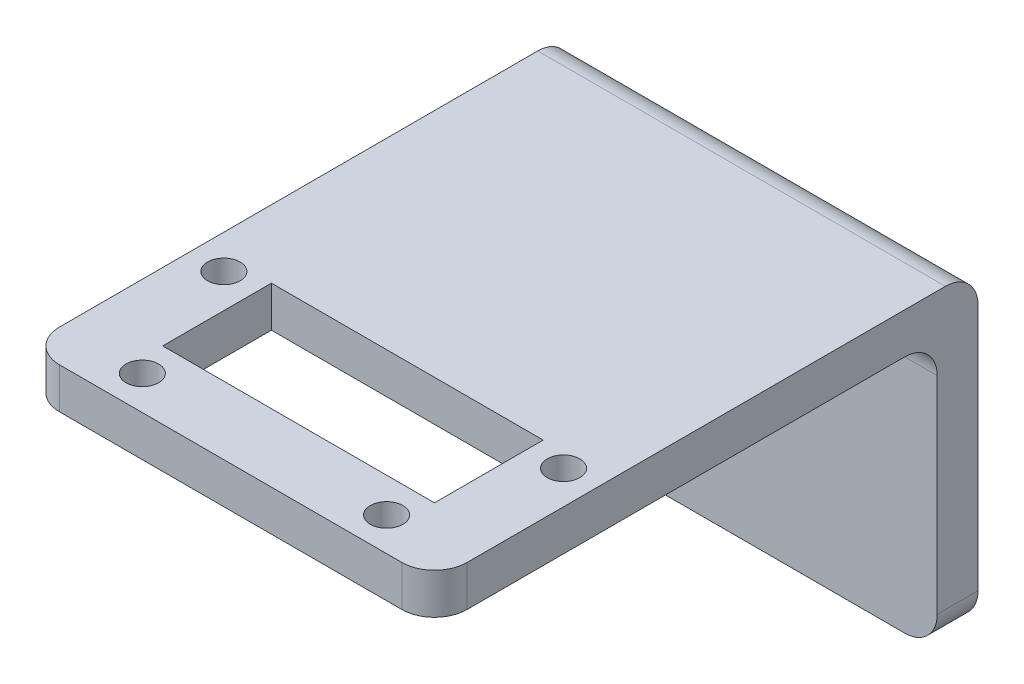
ISO-10303-21;
HEADER;
FILE_DESCRIPTION(('STEP AP214'),'2;1');
FILE_NAME('part.step','',(''),(''),'','','');
FILE_SCHEMA(('AUTOMOTIVE_DESIGN { 1 0 10303 214 1 1 1 1 }'));
ENDSEC;
DATA;
#1=APPLICATION_CONTEXT('core data for automotive mechanical design processes');
#2=APPLICATION_PROTOCOL_DEFINITION('international standard','automotive_design',2000,#1);
#3=PRODUCT_CONTEXT('',#1,'mechanical');
#4=PRODUCT('Part','Part','',(#3));
#5=PRODUCT_RELATED_PRODUCT_CATEGORY('part','',(#4));
#6=PRODUCT_DEFINITION_FORMATION('','',#4);
#7=PRODUCT_DEFINITION_CONTEXT('part definition',#1,'design');
#8=PRODUCT_DEFINITION('design','',#6,#7);
#9=PRODUCT_DEFINITION_SHAPE('','',#8);
#10=(LENGTH_UNIT() NAMED_UNIT(*) SI_UNIT(.MILLI.,.METRE.));
#11=(NAMED_UNIT(*) PLANE_ANGLE_UNIT() SI_UNIT($,.RADIAN.));
#12=(NAMED_UNIT(*) SI_UNIT($,.STERADIAN.) SOLID_ANGLE_UNIT());
#13=UNCERTAINTY_MEASURE_WITH_UNIT(LENGTH_MEASURE(1.E-05),#10,'distance_accuracy_value','');
#14=(GEOMETRIC_REPRESENTATION_CONTEXT(3) GLOBAL_UNCERTAINTY_ASSIGNED_CONTEXT((#13)) GLOBAL_UNIT_ASSIGNED_CONTEXT((#10,
#11,#12)) REPRESENTATION_CONTEXT('',''));
#15=CARTESIAN_POINT('',(0.,0.,0.));
#16=DIRECTION('',(0.,0.,1.));
#17=DIRECTION('',(1.,0.,0.));
#18=AXIS2_PLACEMENT_3D('',#15,#16,#17);
#19=CARTESIAN_POINT('',(0.,0.,0.));
#20=DIRECTION('',(0.,-1.,0.));
#21=DIRECTION('',(0.,0.,-1.));
#22=AXIS2_PLACEMENT_3D('',#19,#20,#21);
#23=PLANE('',#22);
#24=CARTESIAN_POINT('',(-12.5,0.,8.));
#25=DIRECTION('',(0.,-1.,0.));
#26=DIRECTION('',(0.,0.,-1.));
#27=AXIS2_PLACEMENT_3D('',#24,#25,#26);
#28=CIRCLE('',#27,1.2);
#29=CARTESIAN_POINT('',(-12.5,0.,6.8));
#30=VERTEX_POINT('',#29);
#31=EDGE_CURVE('E291',#30,#30,#28,.T.);
#32=ORIENTED_EDGE('',*,*,#31,.F.);
#33=EDGE_LOOP('',(#32));
#34=FACE_BOUND('',#33,.T.);
#35=CARTESIAN_POINT('',(9.00935720361294,0.,17.5339337442584));
#36=DIRECTION('',(0.,-1.,0.));
#37=DIRECTION('',(0.,0.,1.));
#38=AXIS2_PLACEMENT_3D('',#35,#36,#37);
#39=CIRCLE('',#38,1.2);
#40=CARTESIAN_POINT('',(9.00935720361294,0.,18.7339337442584));
#41=VERTEX_POINT('',#40);
#42=EDGE_CURVE('E304',#41,#41,#39,.T.);
#43=ORIENTED_EDGE('',*,*,#42,.F.);
#44=EDGE_LOOP('',(#43));
#45=FACE_BOUND('',#44,.T.);
#46=CARTESIAN_POINT('',(12.5451325660364,0.,8.04719075277392));
#47=DIRECTION('',(0.,-1.,0.));
#48=DIRECTION('',(0.,0.,1.));
#49=AXIS2_PLACEMENT_3D('',#46,#47,#48);
#50=CIRCLE('',#49,1.2);
#51=CARTESIAN_POINT('',(12.5451325660364,0.,9.24719075277392));
#52=VERTEX_POINT('',#51);
#53=EDGE_CURVE('E298',#52,#52,#50,.T.);
#54=ORIENTED_EDGE('',*,*,#53,.F.);
#55=EDGE_LOOP('',(#54));
#56=FACE_BOUND('',#55,.T.);
#57=CARTESIAN_POINT('',(-9.,0.,17.5));
#58=DIRECTION('',(0.,-1.,0.));
#59=DIRECTION('',(0.,0.,-1.));
#60=AXIS2_PLACEMENT_3D('',#57,#58,#59);
#61=CIRCLE('',#60,1.2);
#62=CARTESIAN_POINT('',(-9.,0.,16.3));
#63=VERTEX_POINT('',#62);
#64=EDGE_CURVE('E183',#63,#63,#61,.T.);
#65=ORIENTED_EDGE('',*,*,#64,.F.);
#66=EDGE_LOOP('',(#65));
#67=FACE_BOUND('',#66,.T.);
#68=DIRECTION('',(0.,0.,-1.));
#69=VECTOR('',#68,1.);
#70=CARTESIAN_POINT('',(10.,0.,7.00000000000001));
#71=LINE('',#70,#69);
#72=CARTESIAN_POINT('',(10.,0.,15.));
#73=VERTEX_POINT('',#72);
#74=CARTESIAN_POINT('',(10.,0.,7.00000000000001));
#75=VERTEX_POINT('',#74);
#76=EDGE_CURVE('E157',#73,#75,#71,.T.);
#77=ORIENTED_EDGE('',*,*,#76,.T.);
#78=DIRECTION('',(-1.,0.,0.));
#79=VECTOR('',#78,1.);
#80=CARTESIAN_POINT('',(-10.,0.,7.00000000000001));
#81=LINE('',#80,#79);
#82=CARTESIAN_POINT('',(-10.,0.,7.00000000000001));
#83=VERTEX_POINT('',#82);
#84=EDGE_CURVE('E169',#75,#83,#81,.T.);
#85=ORIENTED_EDGE('',*,*,#84,.T.);
#86=DIRECTION('',(0.,0.,1.));
#87=VECTOR('',#86,1.);
#88=CARTESIAN_POINT('',(-10.,0.,15.));
#89=LINE('',#88,#87);
#90=CARTESIAN_POINT('',(-10.,0.,15.));
#91=VERTEX_POINT('',#90);
#92=EDGE_CURVE('E173',#83,#91,#89,.T.);
#93=ORIENTED_EDGE('',*,*,#92,.T.);
#94=DIRECTION('',(1.,0.,0.));
#95=VECTOR('',#94,1.);
#96=CARTESIAN_POINT('',(10.,0.,15.));
#97=LINE('',#96,#95);
#98=EDGE_CURVE('E165',#91,#73,#97,.T.);
#99=ORIENTED_EDGE('',*,*,#98,.T.);
#100=EDGE_LOOP('',(#77,#85,#93,#99));
#101=FACE_BOUND('',#100,.T.);
#102=DIRECTION('',(0.,0.,-1.));
#103=VECTOR('',#102,1.);
#104=CARTESIAN_POINT('',(15.,0.,20.));
#105=LINE('',#104,#103);
#106=CARTESIAN_POINT('',(15.,0.,17.6));
#107=VERTEX_POINT('',#106);
#108=CARTESIAN_POINT('',(15.,0.,-14.6));
#109=VERTEX_POINT('',#108);
#110=EDGE_CURVE('E196',#107,#109,#105,.T.);
#111=ORIENTED_EDGE('',*,*,#110,.F.);
#112=CARTESIAN_POINT('',(12.6,0.,17.6));
#113=DIRECTION('',(0.,-1.,0.));
#114=DIRECTION('',(0.,0.,-1.));
#115=AXIS2_PLACEMENT_3D('',#112,#113,#114);
#116=CIRCLE('',#115,2.4);
#117=CARTESIAN_POINT('',(12.6,0.,20.));
#118=VERTEX_POINT('',#117);
#119=EDGE_CURVE('E245',#107,#118,#116,.T.);
#120=ORIENTED_EDGE('',*,*,#119,.T.);
#121=DIRECTION('',(1.,0.,0.));
#122=VECTOR('',#121,1.);
#123=CARTESIAN_POINT('',(-15.,0.,20.));
#124=LINE('',#123,#122);
#125=CARTESIAN_POINT('',(-12.6,0.,20.));
#126=VERTEX_POINT('',#125);
#127=EDGE_CURVE('E203',#126,#118,#124,.T.);
#128=ORIENTED_EDGE('',*,*,#127,.F.);
#129=CARTESIAN_POINT('',(-12.6,0.,17.6));
#130=DIRECTION('',(0.,-1.,0.));
#131=DIRECTION('',(0.,0.,-1.));
#132=AXIS2_PLACEMENT_3D('',#129,#130,#131);
#133=CIRCLE('',#132,2.4);
#134=CARTESIAN_POINT('',(-15.,0.,17.6));
#135=VERTEX_POINT('',#134);
#136=EDGE_CURVE('E243',#126,#135,#133,.T.);
#137=ORIENTED_EDGE('',*,*,#136,.T.);
#138=DIRECTION('',(0.,0.,1.));
#139=VECTOR('',#138,1.);
#140=CARTESIAN_POINT('',(-15.,0.,-20.));
#141=LINE('',#140,#139);
#142=CARTESIAN_POINT('',(-15.,0.,-14.6));
#143=VERTEX_POINT('',#142);
#144=EDGE_CURVE('E211',#143,#135,#141,.T.);
#145=ORIENTED_EDGE('',*,*,#144,.F.);
#146=DIRECTION('',(1.,0.,0.));
#147=VECTOR('',#146,1.);
#148=CARTESIAN_POINT('',(15.,0.,-14.6));
#149=LINE('',#148,#147);
#150=EDGE_CURVE('E219',#143,#109,#149,.T.);
#151=ORIENTED_EDGE('',*,*,#150,.T.);
#152=EDGE_LOOP('',(#111,#120,#128,#137,#145,#151));
#153=FACE_BOUND('',#152,.T.);
#154=ADVANCED_FACE('F38',(#34,#45,#56,#67,#101,#153),#23,.T.);
#155=CARTESIAN_POINT('',(15.,3.,20.));
#156=DIRECTION('',(-1.,0.,0.));
#157=DIRECTION('',(0.,0.,1.));
#158=AXIS2_PLACEMENT_3D('',#155,#156,#157);
#159=PLANE('',#158);
#160=DIRECTION('',(0.,1.,0.));
#161=VECTOR('',#160,1.);
#162=CARTESIAN_POINT('',(15.,-20.,-17.));
#163=LINE('',#162,#161);
#164=CARTESIAN_POINT('',(15.,-17.6,-17.));
#165=VERTEX_POINT('',#164);
#166=CARTESIAN_POINT('',(15.,-2.4,-17.));
#167=VERTEX_POINT('',#166);
#168=EDGE_CURVE('E280',#165,#167,#163,.T.);
#169=ORIENTED_EDGE('',*,*,#168,.F.);
#170=DIRECTION('',(0.,0.,1.));
#171=VECTOR('',#170,1.);
#172=CARTESIAN_POINT('',(15.,-17.6,-20.));
#173=LINE('',#172,#171);
#174=CARTESIAN_POINT('',(15.,-17.6,-20.));
#175=VERTEX_POINT('',#174);
#176=EDGE_CURVE('E61',#165,#175,#173,.F.);
#177=ORIENTED_EDGE('',*,*,#176,.T.);
#178=DIRECTION('',(0.,-1.,0.));
#179=VECTOR('',#178,1.);
#180=CARTESIAN_POINT('',(15.,3.,-20.));
#181=LINE('',#180,#179);
#182=CARTESIAN_POINT('',(15.,0.6,-20.));
#183=VERTEX_POINT('',#182);
#184=EDGE_CURVE('E217',#183,#175,#181,.T.);
#185=ORIENTED_EDGE('',*,*,#184,.F.);
#186=CARTESIAN_POINT('',(15.,0.6,-17.6));
#187=DIRECTION('',(-1.,0.,0.));
#188=DIRECTION('',(0.,0.,1.));
#189=AXIS2_PLACEMENT_3D('',#186,#187,#188);
#190=CIRCLE('',#189,2.4);
#191=CARTESIAN_POINT('',(15.,3.,-17.6));
#192=VERTEX_POINT('',#191);
#193=EDGE_CURVE('E237',#183,#192,#190,.F.);
#194=ORIENTED_EDGE('',*,*,#193,.T.);
#195=DIRECTION('',(0.,0.,-1.));
#196=VECTOR('',#195,1.);
#197=CARTESIAN_POINT('',(15.,3.,20.));
#198=LINE('',#197,#196);
#199=CARTESIAN_POINT('',(15.,3.,17.6));
#200=VERTEX_POINT('',#199);
#201=EDGE_CURVE('E200',#200,#192,#198,.T.);
#202=ORIENTED_EDGE('',*,*,#201,.F.);
#203=DIRECTION('',(0.,-1.,0.));
#204=VECTOR('',#203,1.);
#205=CARTESIAN_POINT('',(15.,3.,17.6));
#206=LINE('',#205,#204);
#207=EDGE_CURVE('E240',#200,#107,#206,.T.);
#208=ORIENTED_EDGE('',*,*,#207,.T.);
#209=ORIENTED_EDGE('',*,*,#110,.T.);
#210=CARTESIAN_POINT('',(15.,-2.4,-14.6));
#211=DIRECTION('',(-1.,0.,0.));
#212=DIRECTION('',(0.,0.,1.));
#213=AXIS2_PLACEMENT_3D('',#210,#211,#212);
#214=CIRCLE('',#213,2.4);
#215=EDGE_CURVE('E225',#109,#167,#214,.T.);
#216=ORIENTED_EDGE('',*,*,#215,.T.);
#217=EDGE_LOOP('',(#169,#177,#185,#194,#202,#208,#209,#216));
#218=FACE_BOUND('',#217,.T.);
#219=ADVANCED_FACE('F286',(#218),#159,.F.);
#220=CARTESIAN_POINT('',(-15.,3.,-20.));
#221=DIRECTION('',(0.,0.,1.));
#222=DIRECTION('',(1.,0.,0.));
#223=AXIS2_PLACEMENT_3D('',#220,#221,#222);
#224=PLANE('',#223);
#225=ORIENTED_EDGE('',*,*,#184,.T.);
#226=CARTESIAN_POINT('',(12.6,-17.6,-20.));
#227=DIRECTION('',(0.,0.,1.));
#228=DIRECTION('',(1.,0.,0.));
#229=AXIS2_PLACEMENT_3D('',#226,#227,#228);
#230=CIRCLE('',#229,2.4);
#231=CARTESIAN_POINT('',(12.6,-20.,-20.));
#232=VERTEX_POINT('',#231);
#233=EDGE_CURVE('E46',#175,#232,#230,.F.);
#234=ORIENTED_EDGE('',*,*,#233,.T.);
#235=DIRECTION('',(1.,0.,0.));
#236=VECTOR('',#235,1.);
#237=CARTESIAN_POINT('',(0.,-20.,-20.));
#238=LINE('',#237,#236);
#239=CARTESIAN_POINT('',(-12.6,-20.,-20.));
#240=VERTEX_POINT('',#239);
#241=EDGE_CURVE('E272',#240,#232,#238,.T.);
#242=ORIENTED_EDGE('',*,*,#241,.F.);
#243=CARTESIAN_POINT('',(-12.6,-17.6,-20.));
#244=DIRECTION('',(0.,0.,1.));
#245=DIRECTION('',(1.,0.,0.));
#246=AXIS2_PLACEMENT_3D('',#243,#244,#245);
#247=CIRCLE('',#246,2.4);
#248=CARTESIAN_POINT('',(-15.,-17.6,-20.));
#249=VERTEX_POINT('',#248);
#250=EDGE_CURVE('E53',#240,#249,#247,.F.);
#251=ORIENTED_EDGE('',*,*,#250,.T.);
#252=DIRECTION('',(0.,-1.,0.));
#253=VECTOR('',#252,1.);
#254=CARTESIAN_POINT('',(-15.,3.,-20.));
#255=LINE('',#254,#253);
#256=CARTESIAN_POINT('',(-15.,0.6,-20.));
#257=VERTEX_POINT('',#256);
#258=EDGE_CURVE('E209',#257,#249,#255,.T.);
#259=ORIENTED_EDGE('',*,*,#258,.F.);
#260=DIRECTION('',(-1.,0.,0.));
#261=VECTOR('',#260,1.);
#262=CARTESIAN_POINT('',(-15.,0.6,-20.));
#263=LINE('',#262,#261);
#264=EDGE_CURVE('E235',#257,#183,#263,.F.);
#265=ORIENTED_EDGE('',*,*,#264,.T.);
#266=EDGE_LOOP('',(#225,#234,#242,#251,#259,#265));
#267=FACE_BOUND('',#266,.T.);
#268=ADVANCED_FACE('F271',(#267),#224,.F.);
#269=CARTESIAN_POINT('',(-15.,3.,-20.));
#270=DIRECTION('',(1.,0.,0.));
#271=DIRECTION('',(0.,0.,-1.));
#272=AXIS2_PLACEMENT_3D('',#269,#270,#271);
#273=PLANE('',#272);
#274=ORIENTED_EDGE('',*,*,#258,.T.);
#275=DIRECTION('',(0.,0.,-1.));
#276=VECTOR('',#275,1.);
#277=CARTESIAN_POINT('',(-15.,-17.6,-17.));
#278=LINE('',#277,#276);
#279=CARTESIAN_POINT('',(-15.,-17.6,-17.));
#280=VERTEX_POINT('',#279);
#281=EDGE_CURVE('E11',#249,#280,#278,.F.);
#282=ORIENTED_EDGE('',*,*,#281,.T.);
#283=DIRECTION('',(0.,1.,0.));
#284=VECTOR('',#283,1.);
#285=CARTESIAN_POINT('',(-15.,-20.,-17.));
#286=LINE('',#285,#284);
#287=CARTESIAN_POINT('',(-15.,-2.4,-17.));
#288=VERTEX_POINT('',#287);
#289=EDGE_CURVE('E289',#280,#288,#286,.T.);
#290=ORIENTED_EDGE('',*,*,#289,.T.);
#291=CARTESIAN_POINT('',(-15.,-2.4,-14.6));
#292=DIRECTION('',(1.,0.,0.));
#293=DIRECTION('',(0.,0.,-1.));
#294=AXIS2_PLACEMENT_3D('',#291,#292,#293);
#295=CIRCLE('',#294,2.4);
#296=EDGE_CURVE('E228',#288,#143,#295,.T.);
#297=ORIENTED_EDGE('',*,*,#296,.T.);
#298=ORIENTED_EDGE('',*,*,#144,.T.);
#299=DIRECTION('',(0.,-1.,0.));
#300=VECTOR('',#299,1.);
#301=CARTESIAN_POINT('',(-15.,3.,17.6));
#302=LINE('',#301,#300);
#303=CARTESIAN_POINT('',(-15.,3.,17.6));
#304=VERTEX_POINT('',#303);
#305=EDGE_CURVE('E256',#135,#304,#302,.F.);
#306=ORIENTED_EDGE('',*,*,#305,.T.);
#307=DIRECTION('',(0.,0.,1.));
#308=VECTOR('',#307,1.);
#309=CARTESIAN_POINT('',(-15.,3.,-20.));
#310=LINE('',#309,#308);
#311=CARTESIAN_POINT('',(-15.,3.,-17.6));
#312=VERTEX_POINT('',#311);
#313=EDGE_CURVE('E202',#312,#304,#310,.T.);
#314=ORIENTED_EDGE('',*,*,#313,.F.);
#315=CARTESIAN_POINT('',(-15.,0.6,-17.6));
#316=DIRECTION('',(1.,0.,0.));
#317=DIRECTION('',(0.,0.,-1.));
#318=AXIS2_PLACEMENT_3D('',#315,#316,#317);
#319=CIRCLE('',#318,2.4);
#320=EDGE_CURVE('E233',#312,#257,#319,.F.);
#321=ORIENTED_EDGE('',*,*,#320,.T.);
#322=EDGE_LOOP('',(#274,#282,#290,#297,#298,#306,#314,#321));
#323=FACE_BOUND('',#322,.T.);
#324=ADVANCED_FACE('F335',(#323),#273,.F.);
#325=CARTESIAN_POINT('',(-15.,3.,20.));
#326=DIRECTION('',(0.,0.,-1.));
#327=DIRECTION('',(-1.,0.,0.));
#328=AXIS2_PLACEMENT_3D('',#325,#326,#327);
#329=PLANE('',#328);
#330=ORIENTED_EDGE('',*,*,#127,.T.);
#331=DIRECTION('',(0.,-1.,0.));
#332=VECTOR('',#331,1.);
#333=CARTESIAN_POINT('',(12.6,3.,20.));
#334=LINE('',#333,#332);
#335=CARTESIAN_POINT('',(12.6,3.,20.));
#336=VERTEX_POINT('',#335);
#337=EDGE_CURVE('E250',#118,#336,#334,.F.);
#338=ORIENTED_EDGE('',*,*,#337,.T.);
#339=DIRECTION('',(1.,0.,0.));
#340=VECTOR('',#339,1.);
#341=CARTESIAN_POINT('',(-15.,3.,20.));
#342=LINE('',#341,#340);
#343=CARTESIAN_POINT('',(-12.6,3.,20.));
#344=VERTEX_POINT('',#343);
#345=EDGE_CURVE('E206',#344,#336,#342,.T.);
#346=ORIENTED_EDGE('',*,*,#345,.F.);
#347=DIRECTION('',(0.,-1.,0.));
#348=VECTOR('',#347,1.);
#349=CARTESIAN_POINT('',(-12.6,3.,20.));
#350=LINE('',#349,#348);
#351=EDGE_CURVE('E247',#344,#126,#350,.T.);
#352=ORIENTED_EDGE('',*,*,#351,.T.);
#353=EDGE_LOOP('',(#330,#338,#346,#352));
#354=FACE_BOUND('',#353,.T.);
#355=ADVANCED_FACE('F332',(#354),#329,.F.);
#356=CARTESIAN_POINT('',(0.,3.,0.));
#357=DIRECTION('',(0.,-1.,0.));
#358=DIRECTION('',(0.,0.,-1.));
#359=AXIS2_PLACEMENT_3D('',#356,#357,#358);
#360=PLANE('',#359);
#361=CARTESIAN_POINT('',(-12.5,3.,8.));
#362=DIRECTION('',(0.,-1.,0.));
#363=DIRECTION('',(0.,0.,-1.));
#364=AXIS2_PLACEMENT_3D('',#361,#362,#363);
#365=CIRCLE('',#364,1.2);
#366=CARTESIAN_POINT('',(-12.5,3.,6.8));
#367=VERTEX_POINT('',#366);
#368=EDGE_CURVE('E307',#367,#367,#365,.T.);
#369=ORIENTED_EDGE('',*,*,#368,.T.);
#370=EDGE_LOOP('',(#369));
#371=FACE_BOUND('',#370,.T.);
#372=CARTESIAN_POINT('',(9.00935720361294,3.,17.5339337442584));
#373=DIRECTION('',(0.,-1.,0.));
#374=DIRECTION('',(0.,0.,1.));
#375=AXIS2_PLACEMENT_3D('',#372,#373,#374);
#376=CIRCLE('',#375,1.2);
#377=CARTESIAN_POINT('',(9.00935720361294,3.,18.7339337442584));
#378=VERTEX_POINT('',#377);
#379=EDGE_CURVE('E301',#378,#378,#376,.T.);
#380=ORIENTED_EDGE('',*,*,#379,.T.);
#381=EDGE_LOOP('',(#380));
#382=FACE_BOUND('',#381,.T.);
#383=CARTESIAN_POINT('',(12.5451325660364,3.,8.04719075277392));
#384=DIRECTION('',(0.,-1.,0.));
#385=DIRECTION('',(0.,0.,1.));
#386=AXIS2_PLACEMENT_3D('',#383,#384,#385);
#387=CIRCLE('',#386,1.2);
#388=CARTESIAN_POINT('',(12.5451325660364,3.,9.24719075277392));
#389=VERTEX_POINT('',#388);
#390=EDGE_CURVE('E295',#389,#389,#387,.T.);
#391=ORIENTED_EDGE('',*,*,#390,.T.);
#392=EDGE_LOOP('',(#391));
#393=FACE_BOUND('',#392,.T.);
#394=CARTESIAN_POINT('',(-9.,3.,17.5));
#395=DIRECTION('',(0.,-1.,0.));
#396=DIRECTION('',(0.,0.,-1.));
#397=AXIS2_PLACEMENT_3D('',#394,#395,#396);
#398=CIRCLE('',#397,1.2);
#399=CARTESIAN_POINT('',(-9.,3.,16.3));
#400=VERTEX_POINT('',#399);
#401=EDGE_CURVE('E190',#400,#400,#398,.T.);
#402=ORIENTED_EDGE('',*,*,#401,.T.);
#403=EDGE_LOOP('',(#402));
#404=FACE_BOUND('',#403,.T.);
#405=DIRECTION('',(-1.,0.,0.));
#406=VECTOR('',#405,1.);
#407=CARTESIAN_POINT('',(-10.,3.,7.00000000000001));
#408=LINE('',#407,#406);
#409=CARTESIAN_POINT('',(10.,3.,7.00000000000001));
#410=VERTEX_POINT('',#409);
#411=CARTESIAN_POINT('',(-10.,3.,7.00000000000001));
#412=VERTEX_POINT('',#411);
#413=EDGE_CURVE('E189',#410,#412,#408,.T.);
#414=ORIENTED_EDGE('',*,*,#413,.F.);
#415=DIRECTION('',(0.,0.,-1.));
#416=VECTOR('',#415,1.);
#417=CARTESIAN_POINT('',(10.,3.,7.00000000000001));
#418=LINE('',#417,#416);
#419=CARTESIAN_POINT('',(10.,3.,15.));
#420=VERTEX_POINT('',#419);
#421=EDGE_CURVE('E160',#420,#410,#418,.T.);
#422=ORIENTED_EDGE('',*,*,#421,.F.);
#423=DIRECTION('',(1.,0.,0.));
#424=VECTOR('',#423,1.);
#425=CARTESIAN_POINT('',(10.,3.,15.));
#426=LINE('',#425,#424);
#427=CARTESIAN_POINT('',(-10.,3.,15.));
#428=VERTEX_POINT('',#427);
#429=EDGE_CURVE('E177',#428,#420,#426,.T.);
#430=ORIENTED_EDGE('',*,*,#429,.F.);
#431=DIRECTION('',(0.,0.,1.));
#432=VECTOR('',#431,1.);
#433=CARTESIAN_POINT('',(-10.,3.,15.));
#434=LINE('',#433,#432);
#435=EDGE_CURVE('E180',#412,#428,#434,.T.);
#436=ORIENTED_EDGE('',*,*,#435,.F.);
#437=EDGE_LOOP('',(#414,#422,#430,#436));
#438=FACE_BOUND('',#437,.T.);
#439=ORIENTED_EDGE('',*,*,#345,.T.);
#440=CARTESIAN_POINT('',(12.6,3.,17.6));
#441=DIRECTION('',(0.,-1.,0.));
#442=DIRECTION('',(0.,0.,-1.));
#443=AXIS2_PLACEMENT_3D('',#440,#441,#442);
#444=CIRCLE('',#443,2.4);
#445=EDGE_CURVE('E254',#336,#200,#444,.F.);
#446=ORIENTED_EDGE('',*,*,#445,.T.);
#447=ORIENTED_EDGE('',*,*,#201,.T.);
#448=DIRECTION('',(-1.,0.,0.));
#449=VECTOR('',#448,1.);
#450=CARTESIAN_POINT('',(0.,3.,-17.6));
#451=LINE('',#450,#449);
#452=EDGE_CURVE('E230',#192,#312,#451,.T.);
#453=ORIENTED_EDGE('',*,*,#452,.T.);
#454=ORIENTED_EDGE('',*,*,#313,.T.);
#455=CARTESIAN_POINT('',(-12.6,3.,17.6));
#456=DIRECTION('',(0.,-1.,0.));
#457=DIRECTION('',(0.,0.,-1.));
#458=AXIS2_PLACEMENT_3D('',#455,#456,#457);
#459=CIRCLE('',#458,2.4);
#460=EDGE_CURVE('E252',#304,#344,#459,.F.);
#461=ORIENTED_EDGE('',*,*,#460,.T.);
#462=EDGE_LOOP('',(#439,#446,#447,#453,#454,#461));
#463=FACE_BOUND('',#462,.T.);
#464=ADVANCED_FACE('F330',(#371,#382,#393,#404,#438,#463),#360,.F.);
#465=CARTESIAN_POINT('',(10.,0.,7.00000000000001));
#466=DIRECTION('',(1.,0.,0.));
#467=DIRECTION('',(0.,0.,-1.));
#468=AXIS2_PLACEMENT_3D('',#465,#466,#467);
#469=PLANE('',#468);
#470=ORIENTED_EDGE('',*,*,#421,.T.);
#471=DIRECTION('',(0.,1.,0.));
#472=VECTOR('',#471,1.);
#473=CARTESIAN_POINT('',(10.,0.,7.00000000000001));
#474=LINE('',#473,#472);
#475=EDGE_CURVE('E153',#75,#410,#474,.T.);
#476=ORIENTED_EDGE('',*,*,#475,.F.);
#477=ORIENTED_EDGE('',*,*,#76,.F.);
#478=DIRECTION('',(0.,1.,0.));
#479=VECTOR('',#478,1.);
#480=CARTESIAN_POINT('',(10.,0.,15.));
#481=LINE('',#480,#479);
#482=EDGE_CURVE('E194',#73,#420,#481,.T.);
#483=ORIENTED_EDGE('',*,*,#482,.T.);
#484=EDGE_LOOP('',(#470,#476,#477,#483));
#485=FACE_BOUND('',#484,.T.);
#486=ADVANCED_FACE('F155',(#485),#469,.F.);
#487=CARTESIAN_POINT('',(10.,0.,15.));
#488=DIRECTION('',(0.,0.,1.));
#489=DIRECTION('',(1.,0.,0.));
#490=AXIS2_PLACEMENT_3D('',#487,#488,#489);
#491=PLANE('',#490);
#492=ORIENTED_EDGE('',*,*,#429,.T.);
#493=ORIENTED_EDGE('',*,*,#482,.F.);
#494=ORIENTED_EDGE('',*,*,#98,.F.);
#495=DIRECTION('',(0.,1.,0.));
#496=VECTOR('',#495,1.);
#497=CARTESIAN_POINT('',(-10.,0.,15.));
#498=LINE('',#497,#496);
#499=EDGE_CURVE('E197',#91,#428,#498,.T.);
#500=ORIENTED_EDGE('',*,*,#499,.T.);
#501=EDGE_LOOP('',(#492,#493,#494,#500));
#502=FACE_BOUND('',#501,.T.);
#503=ADVANCED_FACE('F390',(#502),#491,.F.);
#504=CARTESIAN_POINT('',(-10.,0.,15.));
#505=DIRECTION('',(-1.,0.,0.));
#506=DIRECTION('',(0.,0.,1.));
#507=AXIS2_PLACEMENT_3D('',#504,#505,#506);
#508=PLANE('',#507);
#509=ORIENTED_EDGE('',*,*,#435,.T.);
#510=ORIENTED_EDGE('',*,*,#499,.F.);
#511=ORIENTED_EDGE('',*,*,#92,.F.);
#512=DIRECTION('',(0.,1.,0.));
#513=VECTOR('',#512,1.);
#514=CARTESIAN_POINT('',(-10.,0.,7.00000000000001));
#515=LINE('',#514,#513);
#516=EDGE_CURVE('E164',#83,#412,#515,.T.);
#517=ORIENTED_EDGE('',*,*,#516,.T.);
#518=EDGE_LOOP('',(#509,#510,#511,#517));
#519=FACE_BOUND('',#518,.T.);
#520=ADVANCED_FACE('F400',(#519),#508,.F.);
#521=CARTESIAN_POINT('',(-10.,0.,7.00000000000001));
#522=DIRECTION('',(0.,0.,-1.));
#523=DIRECTION('',(-1.,0.,0.));
#524=AXIS2_PLACEMENT_3D('',#521,#522,#523);
#525=PLANE('',#524);
#526=ORIENTED_EDGE('',*,*,#413,.T.);
#527=ORIENTED_EDGE('',*,*,#516,.F.);
#528=ORIENTED_EDGE('',*,*,#84,.F.);
#529=ORIENTED_EDGE('',*,*,#475,.T.);
#530=EDGE_LOOP('',(#526,#527,#528,#529));
#531=FACE_BOUND('',#530,.T.);
#532=ADVANCED_FACE('F170',(#531),#525,.F.);
#533=CARTESIAN_POINT('',(-9.,3.,17.5));
#534=DIRECTION('',(0.,-1.,0.));
#535=DIRECTION('',(0.,0.,-1.));
#536=AXIS2_PLACEMENT_3D('',#533,#534,#535);
#537=CYLINDRICAL_SURFACE('',#536,1.2);
#538=ORIENTED_EDGE('',*,*,#401,.F.);
#539=EDGE_LOOP('',(#538));
#540=FACE_BOUND('',#539,.T.);
#541=ORIENTED_EDGE('',*,*,#64,.T.);
#542=EDGE_LOOP('',(#541));
#543=FACE_BOUND('',#542,.T.);
#544=ADVANCED_FACE('F317',(#540,#543),#537,.F.);
#545=CARTESIAN_POINT('',(12.5451325660364,3.,8.04719075277392));
#546=DIRECTION('',(0.,-1.,0.));
#547=DIRECTION('',(0.,0.,-1.));
#548=AXIS2_PLACEMENT_3D('',#545,#546,#547);
#549=CYLINDRICAL_SURFACE('',#548,1.2);
#550=ORIENTED_EDGE('',*,*,#390,.F.);
#551=EDGE_LOOP('',(#550));
#552=FACE_BOUND('',#551,.T.);
#553=ORIENTED_EDGE('',*,*,#53,.T.);
#554=EDGE_LOOP('',(#553));
#555=FACE_BOUND('',#554,.T.);
#556=ADVANCED_FACE('F415',(#552,#555),#549,.F.);
#557=CARTESIAN_POINT('',(9.00935720361294,3.,17.5339337442584));
#558=DIRECTION('',(0.,-1.,0.));
#559=DIRECTION('',(0.,0.,-1.));
#560=AXIS2_PLACEMENT_3D('',#557,#558,#559);
#561=CYLINDRICAL_SURFACE('',#560,1.2);
#562=ORIENTED_EDGE('',*,*,#379,.F.);
#563=EDGE_LOOP('',(#562));
#564=FACE_BOUND('',#563,.T.);
#565=ORIENTED_EDGE('',*,*,#42,.T.);
#566=EDGE_LOOP('',(#565));
#567=FACE_BOUND('',#566,.T.);
#568=ADVANCED_FACE('F420',(#564,#567),#561,.F.);
#569=CARTESIAN_POINT('',(-12.5,3.,8.));
#570=DIRECTION('',(0.,-1.,0.));
#571=DIRECTION('',(0.,0.,-1.));
#572=AXIS2_PLACEMENT_3D('',#569,#570,#571);
#573=CYLINDRICAL_SURFACE('',#572,1.2);
#574=ORIENTED_EDGE('',*,*,#368,.F.);
#575=EDGE_LOOP('',(#574));
#576=FACE_BOUND('',#575,.T.);
#577=ORIENTED_EDGE('',*,*,#31,.T.);
#578=EDGE_LOOP('',(#577));
#579=FACE_BOUND('',#578,.T.);
#580=ADVANCED_FACE('F426',(#576,#579),#573,.F.);
#581=CARTESIAN_POINT('',(0.,-20.,-17.));
#582=DIRECTION('',(0.,0.,1.));
#583=DIRECTION('',(1.,0.,0.));
#584=AXIS2_PLACEMENT_3D('',#581,#582,#583);
#585=PLANE('',#584);
#586=DIRECTION('',(1.,0.,0.));
#587=VECTOR('',#586,1.);
#588=CARTESIAN_POINT('',(0.,-20.,-17.));
#589=LINE('',#588,#587);
#590=CARTESIAN_POINT('',(-12.6,-20.,-17.));
#591=VERTEX_POINT('',#590);
#592=CARTESIAN_POINT('',(12.6,-20.,-17.));
#593=VERTEX_POINT('',#592);
#594=EDGE_CURVE('E281',#591,#593,#589,.T.);
#595=ORIENTED_EDGE('',*,*,#594,.T.);
#596=CARTESIAN_POINT('',(12.6,-17.6,-17.));
#597=DIRECTION('',(0.,0.,1.));
#598=DIRECTION('',(1.,0.,0.));
#599=AXIS2_PLACEMENT_3D('',#596,#597,#598);
#600=CIRCLE('',#599,2.4);
#601=EDGE_CURVE('E266',#593,#165,#600,.T.);
#602=ORIENTED_EDGE('',*,*,#601,.T.);
#603=ORIENTED_EDGE('',*,*,#168,.T.);
#604=DIRECTION('',(1.,0.,0.));
#605=VECTOR('',#604,1.);
#606=CARTESIAN_POINT('',(-15.,-2.4,-17.));
#607=LINE('',#606,#605);
#608=EDGE_CURVE('E222',#167,#288,#607,.F.);
#609=ORIENTED_EDGE('',*,*,#608,.T.);
#610=ORIENTED_EDGE('',*,*,#289,.F.);
#611=CARTESIAN_POINT('',(-12.6,-17.6,-17.));
#612=DIRECTION('',(0.,0.,1.));
#613=DIRECTION('',(1.,0.,0.));
#614=AXIS2_PLACEMENT_3D('',#611,#612,#613);
#615=CIRCLE('',#614,2.4);
#616=EDGE_CURVE('E264',#280,#591,#615,.T.);
#617=ORIENTED_EDGE('',*,*,#616,.T.);
#618=EDGE_LOOP('',(#595,#602,#603,#609,#610,#617));
#619=FACE_BOUND('',#618,.T.);
#620=ADVANCED_FACE('F285',(#619),#585,.T.);
#621=CARTESIAN_POINT('',(0.,-20.,0.));
#622=DIRECTION('',(0.,-1.,0.));
#623=DIRECTION('',(0.,0.,-1.));
#624=AXIS2_PLACEMENT_3D('',#621,#622,#623);
#625=PLANE('',#624);
#626=ORIENTED_EDGE('',*,*,#241,.T.);
#627=DIRECTION('',(0.,0.,1.));
#628=VECTOR('',#627,1.);
#629=CARTESIAN_POINT('',(12.6,-20.,-17.));
#630=LINE('',#629,#628);
#631=EDGE_CURVE('E261',#232,#593,#630,.T.);
#632=ORIENTED_EDGE('',*,*,#631,.T.);
#633=ORIENTED_EDGE('',*,*,#594,.F.);
#634=DIRECTION('',(0.,0.,-1.));
#635=VECTOR('',#634,1.);
#636=CARTESIAN_POINT('',(-12.6,-20.,-20.));
#637=LINE('',#636,#635);
#638=EDGE_CURVE('E258',#591,#240,#637,.T.);
#639=ORIENTED_EDGE('',*,*,#638,.T.);
#640=EDGE_LOOP('',(#626,#632,#633,#639));
#641=FACE_BOUND('',#640,.T.);
#642=ADVANCED_FACE('F276',(#641),#625,.T.);
#643=CARTESIAN_POINT('',(0.,-2.4,-14.6));
#644=DIRECTION('',(-1.,0.,0.));
#645=DIRECTION('',(0.,0.,1.));
#646=AXIS2_PLACEMENT_3D('',#643,#644,#645);
#647=CYLINDRICAL_SURFACE('',#646,2.4);
#648=ORIENTED_EDGE('',*,*,#296,.F.);
#649=ORIENTED_EDGE('',*,*,#608,.F.);
#650=ORIENTED_EDGE('',*,*,#215,.F.);
#651=ORIENTED_EDGE('',*,*,#150,.F.);
#652=EDGE_LOOP('',(#648,#649,#650,#651));
#653=FACE_BOUND('',#652,.T.);
#654=ADVANCED_FACE('F342',(#653),#647,.F.);
#655=CARTESIAN_POINT('',(0.,0.6,-17.6));
#656=DIRECTION('',(-1.,0.,0.));
#657=DIRECTION('',(0.,0.,1.));
#658=AXIS2_PLACEMENT_3D('',#655,#656,#657);
#659=CYLINDRICAL_SURFACE('',#658,2.4);
#660=ORIENTED_EDGE('',*,*,#193,.F.);
#661=ORIENTED_EDGE('',*,*,#264,.F.);
#662=ORIENTED_EDGE('',*,*,#320,.F.);
#663=ORIENTED_EDGE('',*,*,#452,.F.);
#664=EDGE_LOOP('',(#660,#661,#662,#663));
#665=FACE_BOUND('',#664,.T.);
#666=ADVANCED_FACE('F345',(#665),#659,.T.);
#667=CARTESIAN_POINT('',(12.6,3.,17.6));
#668=DIRECTION('',(0.,-1.,0.));
#669=DIRECTION('',(0.,0.,-1.));
#670=AXIS2_PLACEMENT_3D('',#667,#668,#669);
#671=CYLINDRICAL_SURFACE('',#670,2.4);
#672=ORIENTED_EDGE('',*,*,#445,.F.);
#673=ORIENTED_EDGE('',*,*,#337,.F.);
#674=ORIENTED_EDGE('',*,*,#119,.F.);
#675=ORIENTED_EDGE('',*,*,#207,.F.);
#676=EDGE_LOOP('',(#672,#673,#674,#675));
#677=FACE_BOUND('',#676,.T.);
#678=ADVANCED_FACE('F349',(#677),#671,.T.);
#679=CARTESIAN_POINT('',(-12.6,3.,17.6));
#680=DIRECTION('',(0.,-1.,0.));
#681=DIRECTION('',(0.,0.,-1.));
#682=AXIS2_PLACEMENT_3D('',#679,#680,#681);
#683=CYLINDRICAL_SURFACE('',#682,2.4);
#684=ORIENTED_EDGE('',*,*,#460,.F.);
#685=ORIENTED_EDGE('',*,*,#305,.F.);
#686=ORIENTED_EDGE('',*,*,#136,.F.);
#687=ORIENTED_EDGE('',*,*,#351,.F.);
#688=EDGE_LOOP('',(#684,#685,#686,#687));
#689=FACE_BOUND('',#688,.T.);
#690=ADVANCED_FACE('F353',(#689),#683,.T.);
#691=CARTESIAN_POINT('',(12.6,-17.6,0.));
#692=DIRECTION('',(0.,0.,-1.));
#693=DIRECTION('',(-1.,0.,0.));
#694=AXIS2_PLACEMENT_3D('',#691,#692,#693);
#695=CYLINDRICAL_SURFACE('',#694,2.4);
#696=ORIENTED_EDGE('',*,*,#233,.F.);
#697=ORIENTED_EDGE('',*,*,#176,.F.);
#698=ORIENTED_EDGE('',*,*,#601,.F.);
#699=ORIENTED_EDGE('',*,*,#631,.F.);
#700=EDGE_LOOP('',(#696,#697,#698,#699));
#701=FACE_BOUND('',#700,.T.);
#702=ADVANCED_FACE('F283',(#701),#695,.T.);
#703=CARTESIAN_POINT('',(-12.6,-17.6,0.));
#704=DIRECTION('',(0.,0.,1.));
#705=DIRECTION('',(1.,0.,0.));
#706=AXIS2_PLACEMENT_3D('',#703,#704,#705);
#707=CYLINDRICAL_SURFACE('',#706,2.4);
#708=ORIENTED_EDGE('',*,*,#616,.F.);
#709=ORIENTED_EDGE('',*,*,#281,.F.);
#710=ORIENTED_EDGE('',*,*,#250,.F.);
#711=ORIENTED_EDGE('',*,*,#638,.F.);
#712=EDGE_LOOP('',(#708,#709,#710,#711));
#713=FACE_BOUND('',#712,.T.);
#714=ADVANCED_FACE('F40',(#713),#707,.T.);
#715=CLOSED_SHELL('',(#154,#219,#268,#324,#355,#464,#486,#503,#520,#532,#544,#556,#568,#580,
#620,#642,#654,#666,#678,#690,#702,#714));
#716=MANIFOLD_SOLID_BREP('B2',#715);
#717=ADVANCED_BREP_SHAPE_REPRESENTATION('',(#18,#716),#14);
#718=SHAPE_DEFINITION_REPRESENTATION(#9,#717);
ENDSEC;
END-ISO-10303-21;
